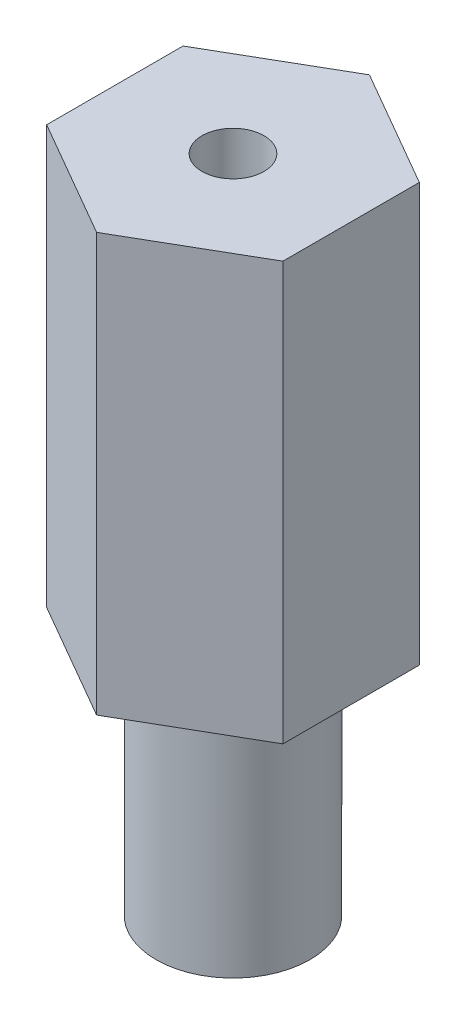
ISO-10303-21;
HEADER;
FILE_DESCRIPTION(('STEP AP214'),'2;1');
FILE_NAME('part.step','',(''),(''),'','','');
FILE_SCHEMA(('AUTOMOTIVE_DESIGN { 1 0 10303 214 1 1 1 1 }'));
ENDSEC;
DATA;
#1=APPLICATION_CONTEXT('core data for automotive mechanical design processes');
#2=APPLICATION_PROTOCOL_DEFINITION('international standard','automotive_design',2000,#1);
#3=PRODUCT_CONTEXT('',#1,'mechanical');
#4=PRODUCT('Part','Part','',(#3));
#5=PRODUCT_RELATED_PRODUCT_CATEGORY('part','',(#4));
#6=PRODUCT_DEFINITION_FORMATION('','',#4);
#7=PRODUCT_DEFINITION_CONTEXT('part definition',#1,'design');
#8=PRODUCT_DEFINITION('design','',#6,#7);
#9=PRODUCT_DEFINITION_SHAPE('','',#8);
#10=(LENGTH_UNIT() NAMED_UNIT(*) SI_UNIT(.MILLI.,.METRE.));
#11=(NAMED_UNIT(*) PLANE_ANGLE_UNIT() SI_UNIT($,.RADIAN.));
#12=(NAMED_UNIT(*) SI_UNIT($,.STERADIAN.) SOLID_ANGLE_UNIT());
#13=UNCERTAINTY_MEASURE_WITH_UNIT(LENGTH_MEASURE(1.E-05),#10,'distance_accuracy_value','');
#14=(GEOMETRIC_REPRESENTATION_CONTEXT(3) GLOBAL_UNCERTAINTY_ASSIGNED_CONTEXT((#13)) GLOBAL_UNIT_ASSIGNED_CONTEXT((#10,
#11,#12)) REPRESENTATION_CONTEXT('',''));
#15=CARTESIAN_POINT('',(0.,0.,0.));
#16=DIRECTION('',(0.,0.,1.));
#17=DIRECTION('',(1.,0.,0.));
#18=AXIS2_PLACEMENT_3D('',#15,#16,#17);
#19=CARTESIAN_POINT('',(2.2606,0.,-1.30515801853007));
#20=DIRECTION('',(0.,1.,0.));
#21=DIRECTION('',(0.,0.,1.));
#22=AXIS2_PLACEMENT_3D('',#19,#20,#21);
#23=PLANE('',#22);
#24=DIRECTION('',(0.,0.,-1.));
#25=VECTOR('',#24,1.);
#26=CARTESIAN_POINT('',(2.2606,0.,1.30515801853007));
#27=LINE('',#26,#25);
#28=CARTESIAN_POINT('',(2.2606,0.,1.30515801853007));
#29=VERTEX_POINT('',#28);
#30=CARTESIAN_POINT('',(2.2606,0.,-1.30515801853007));
#31=VERTEX_POINT('',#30);
#32=EDGE_CURVE('E120',#29,#31,#27,.T.);
#33=ORIENTED_EDGE('',*,*,#32,.F.);
#34=DIRECTION('',(0.866025403784438,0.,-0.5));
#35=VECTOR('',#34,1.);
#36=CARTESIAN_POINT('',(0.,0.,2.61031603706014));
#37=LINE('',#36,#35);
#38=CARTESIAN_POINT('',(0.,0.,2.61031603706014));
#39=VERTEX_POINT('',#38);
#40=EDGE_CURVE('E80',#39,#29,#37,.T.);
#41=ORIENTED_EDGE('',*,*,#40,.F.);
#42=DIRECTION('',(0.866025403784439,0.,0.5));
#43=VECTOR('',#42,1.);
#44=CARTESIAN_POINT('',(-2.2606,0.,1.30515801853007));
#45=LINE('',#44,#43);
#46=CARTESIAN_POINT('',(-2.2606,0.,1.30515801853007));
#47=VERTEX_POINT('',#46);
#48=EDGE_CURVE('E74',#47,#39,#45,.T.);
#49=ORIENTED_EDGE('',*,*,#48,.F.);
#50=DIRECTION('',(0.,0.,1.));
#51=VECTOR('',#50,1.);
#52=CARTESIAN_POINT('',(-2.2606,0.,-1.30515801853007));
#53=LINE('',#52,#51);
#54=CARTESIAN_POINT('',(-2.2606,0.,-1.30515801853007));
#55=VERTEX_POINT('',#54);
#56=EDGE_CURVE('E110',#55,#47,#53,.T.);
#57=ORIENTED_EDGE('',*,*,#56,.F.);
#58=DIRECTION('',(-0.866025403784439,0.,0.5));
#59=VECTOR('',#58,1.);
#60=CARTESIAN_POINT('',(0.,0.,-2.61031603706014));
#61=LINE('',#60,#59);
#62=CARTESIAN_POINT('',(0.,0.,-2.61031603706014));
#63=VERTEX_POINT('',#62);
#64=EDGE_CURVE('E126',#63,#55,#61,.T.);
#65=ORIENTED_EDGE('',*,*,#64,.F.);
#66=DIRECTION('',(-0.866025403784439,0.,-0.5));
#67=VECTOR('',#66,1.);
#68=CARTESIAN_POINT('',(2.2606,0.,-1.30515801853007));
#69=LINE('',#68,#67);
#70=EDGE_CURVE('E123',#31,#63,#69,.T.);
#71=ORIENTED_EDGE('',*,*,#70,.F.);
#72=EDGE_LOOP('',(#33,#41,#49,#57,#65,#71));
#73=FACE_BOUND('',#72,.T.);
#74=CARTESIAN_POINT('',(0.,0.,0.));
#75=DIRECTION('',(0.,1.,0.));
#76=DIRECTION('',(0.,0.,1.));
#77=AXIS2_PLACEMENT_3D('',#74,#75,#76);
#78=CIRCLE('',#77,1.4732);
#79=CARTESIAN_POINT('',(0.,0.,1.4732));
#80=VERTEX_POINT('',#79);
#81=EDGE_CURVE('E11',#80,#80,#78,.F.);
#82=ORIENTED_EDGE('',*,*,#81,.F.);
#83=EDGE_LOOP('',(#82));
#84=FACE_BOUND('',#83,.T.);
#85=ADVANCED_FACE('F34',(#73,#84),#23,.F.);
#86=CARTESIAN_POINT('',(2.2606,8.,1.30515801853007));
#87=DIRECTION('',(-1.,0.,0.));
#88=DIRECTION('',(0.,0.,1.));
#89=AXIS2_PLACEMENT_3D('',#86,#87,#88);
#90=PLANE('',#89);
#91=ORIENTED_EDGE('',*,*,#32,.T.);
#92=DIRECTION('',(0.,-1.,0.));
#93=VECTOR('',#92,1.);
#94=CARTESIAN_POINT('',(2.2606,8.,-1.30515801853007));
#95=LINE('',#94,#93);
#96=CARTESIAN_POINT('',(2.2606,8.,-1.30515801853007));
#97=VERTEX_POINT('',#96);
#98=EDGE_CURVE('E43',#97,#31,#95,.T.);
#99=ORIENTED_EDGE('',*,*,#98,.F.);
#100=DIRECTION('',(0.,0.,-1.));
#101=VECTOR('',#100,1.);
#102=CARTESIAN_POINT('',(2.2606,8.,1.30515801853007));
#103=LINE('',#102,#101);
#104=CARTESIAN_POINT('',(2.2606,8.,1.30515801853007));
#105=VERTEX_POINT('',#104);
#106=EDGE_CURVE('E131',#105,#97,#103,.T.);
#107=ORIENTED_EDGE('',*,*,#106,.F.);
#108=DIRECTION('',(0.,-1.,0.));
#109=VECTOR('',#108,1.);
#110=CARTESIAN_POINT('',(2.2606,8.,1.30515801853007));
#111=LINE('',#110,#109);
#112=EDGE_CURVE('E116',#105,#29,#111,.T.);
#113=ORIENTED_EDGE('',*,*,#112,.T.);
#114=EDGE_LOOP('',(#91,#99,#107,#113));
#115=FACE_BOUND('',#114,.T.);
#116=ADVANCED_FACE('F36',(#115),#90,.F.);
#117=CARTESIAN_POINT('',(2.2606,8.,-1.30515801853007));
#118=DIRECTION('',(-0.5,0.,0.866025403784439));
#119=DIRECTION('',(0.866025403784439,0.,0.5));
#120=AXIS2_PLACEMENT_3D('',#117,#118,#119);
#121=PLANE('',#120);
#122=ORIENTED_EDGE('',*,*,#70,.T.);
#123=DIRECTION('',(0.,-1.,0.));
#124=VECTOR('',#123,1.);
#125=CARTESIAN_POINT('',(0.,8.,-2.61031603706014));
#126=LINE('',#125,#124);
#127=CARTESIAN_POINT('',(0.,8.,-2.61031603706014));
#128=VERTEX_POINT('',#127);
#129=EDGE_CURVE('E135',#128,#63,#126,.T.);
#130=ORIENTED_EDGE('',*,*,#129,.F.);
#131=DIRECTION('',(-0.866025403784439,0.,-0.5));
#132=VECTOR('',#131,1.);
#133=CARTESIAN_POINT('',(2.2606,8.,-1.30515801853007));
#134=LINE('',#133,#132);
#135=EDGE_CURVE('E89',#97,#128,#134,.T.);
#136=ORIENTED_EDGE('',*,*,#135,.F.);
#137=ORIENTED_EDGE('',*,*,#98,.T.);
#138=EDGE_LOOP('',(#122,#130,#136,#137));
#139=FACE_BOUND('',#138,.T.);
#140=ADVANCED_FACE('F138',(#139),#121,.F.);
#141=CARTESIAN_POINT('',(0.,8.,-2.61031603706014));
#142=DIRECTION('',(0.5,0.,0.866025403784439));
#143=DIRECTION('',(0.866025403784439,0.,-0.5));
#144=AXIS2_PLACEMENT_3D('',#141,#142,#143);
#145=PLANE('',#144);
#146=ORIENTED_EDGE('',*,*,#64,.T.);
#147=DIRECTION('',(0.,-1.,0.));
#148=VECTOR('',#147,1.);
#149=CARTESIAN_POINT('',(-2.2606,8.,-1.30515801853007));
#150=LINE('',#149,#148);
#151=CARTESIAN_POINT('',(-2.2606,8.,-1.30515801853007));
#152=VERTEX_POINT('',#151);
#153=EDGE_CURVE('E111',#152,#55,#150,.T.);
#154=ORIENTED_EDGE('',*,*,#153,.F.);
#155=DIRECTION('',(-0.866025403784439,0.,0.5));
#156=VECTOR('',#155,1.);
#157=CARTESIAN_POINT('',(0.,8.,-2.61031603706014));
#158=LINE('',#157,#156);
#159=EDGE_CURVE('E102',#128,#152,#158,.T.);
#160=ORIENTED_EDGE('',*,*,#159,.F.);
#161=ORIENTED_EDGE('',*,*,#129,.T.);
#162=EDGE_LOOP('',(#146,#154,#160,#161));
#163=FACE_BOUND('',#162,.T.);
#164=ADVANCED_FACE('F146',(#163),#145,.F.);
#165=CARTESIAN_POINT('',(-2.2606,8.,-1.30515801853007));
#166=DIRECTION('',(1.,0.,0.));
#167=DIRECTION('',(0.,0.,-1.));
#168=AXIS2_PLACEMENT_3D('',#165,#166,#167);
#169=PLANE('',#168);
#170=ORIENTED_EDGE('',*,*,#56,.T.);
#171=DIRECTION('',(0.,-1.,0.));
#172=VECTOR('',#171,1.);
#173=CARTESIAN_POINT('',(-2.2606,8.,1.30515801853007));
#174=LINE('',#173,#172);
#175=CARTESIAN_POINT('',(-2.2606,8.,1.30515801853007));
#176=VERTEX_POINT('',#175);
#177=EDGE_CURVE('E107',#176,#47,#174,.T.);
#178=ORIENTED_EDGE('',*,*,#177,.F.);
#179=DIRECTION('',(0.,0.,1.));
#180=VECTOR('',#179,1.);
#181=CARTESIAN_POINT('',(-2.2606,8.,-1.30515801853007));
#182=LINE('',#181,#180);
#183=EDGE_CURVE('E96',#152,#176,#182,.T.);
#184=ORIENTED_EDGE('',*,*,#183,.F.);
#185=ORIENTED_EDGE('',*,*,#153,.T.);
#186=EDGE_LOOP('',(#170,#178,#184,#185));
#187=FACE_BOUND('',#186,.T.);
#188=ADVANCED_FACE('F108',(#187),#169,.F.);
#189=CARTESIAN_POINT('',(-2.2606,8.,1.30515801853007));
#190=DIRECTION('',(0.5,0.,-0.866025403784439));
#191=DIRECTION('',(-0.866025403784439,0.,-0.5));
#192=AXIS2_PLACEMENT_3D('',#189,#190,#191);
#193=PLANE('',#192);
#194=ORIENTED_EDGE('',*,*,#48,.T.);
#195=DIRECTION('',(0.,-1.,0.));
#196=VECTOR('',#195,1.);
#197=CARTESIAN_POINT('',(0.,8.,2.61031603706014));
#198=LINE('',#197,#196);
#199=CARTESIAN_POINT('',(0.,8.,2.61031603706014));
#200=VERTEX_POINT('',#199);
#201=EDGE_CURVE('E112',#200,#39,#198,.T.);
#202=ORIENTED_EDGE('',*,*,#201,.F.);
#203=DIRECTION('',(0.866025403784439,0.,0.5));
#204=VECTOR('',#203,1.);
#205=CARTESIAN_POINT('',(-2.2606,8.,1.30515801853007));
#206=LINE('',#205,#204);
#207=EDGE_CURVE('E100',#176,#200,#206,.T.);
#208=ORIENTED_EDGE('',*,*,#207,.F.);
#209=ORIENTED_EDGE('',*,*,#177,.T.);
#210=EDGE_LOOP('',(#194,#202,#208,#209));
#211=FACE_BOUND('',#210,.T.);
#212=ADVANCED_FACE('F114',(#211),#193,.F.);
#213=CARTESIAN_POINT('',(0.,8.,2.61031603706014));
#214=DIRECTION('',(-0.5,0.,-0.866025403784439));
#215=DIRECTION('',(-0.866025403784439,0.,0.5));
#216=AXIS2_PLACEMENT_3D('',#213,#214,#215);
#217=PLANE('',#216);
#218=ORIENTED_EDGE('',*,*,#40,.T.);
#219=ORIENTED_EDGE('',*,*,#112,.F.);
#220=DIRECTION('',(0.866025403784438,0.,-0.5));
#221=VECTOR('',#220,1.);
#222=CARTESIAN_POINT('',(0.,8.,2.61031603706014));
#223=LINE('',#222,#221);
#224=EDGE_CURVE('E51',#200,#105,#223,.T.);
#225=ORIENTED_EDGE('',*,*,#224,.F.);
#226=ORIENTED_EDGE('',*,*,#201,.T.);
#227=EDGE_LOOP('',(#218,#219,#225,#226));
#228=FACE_BOUND('',#227,.T.);
#229=ADVANCED_FACE('F170',(#228),#217,.F.);
#230=CARTESIAN_POINT('',(2.2606,8.,-1.30515801853007));
#231=DIRECTION('',(0.,1.,0.));
#232=DIRECTION('',(0.,0.,1.));
#233=AXIS2_PLACEMENT_3D('',#230,#231,#232);
#234=PLANE('',#233);
#235=CARTESIAN_POINT('',(0.,8.,0.));
#236=DIRECTION('',(0.,1.,0.));
#237=DIRECTION('',(0.,0.,1.));
#238=AXIS2_PLACEMENT_3D('',#235,#236,#237);
#239=CIRCLE('',#238,0.593671867306966);
#240=CARTESIAN_POINT('',(0.,8.,0.593671867306966));
#241=VERTEX_POINT('',#240);
#242=EDGE_CURVE('E153',#241,#241,#239,.T.);
#243=ORIENTED_EDGE('',*,*,#242,.F.);
#244=EDGE_LOOP('',(#243));
#245=FACE_BOUND('',#244,.T.);
#246=ORIENTED_EDGE('',*,*,#106,.T.);
#247=ORIENTED_EDGE('',*,*,#135,.T.);
#248=ORIENTED_EDGE('',*,*,#159,.T.);
#249=ORIENTED_EDGE('',*,*,#183,.T.);
#250=ORIENTED_EDGE('',*,*,#207,.T.);
#251=ORIENTED_EDGE('',*,*,#224,.T.);
#252=EDGE_LOOP('',(#246,#247,#248,#249,#250,#251));
#253=FACE_BOUND('',#252,.T.);
#254=ADVANCED_FACE('F98',(#245,#253),#234,.T.);
#255=CARTESIAN_POINT('',(0.,-4.6228,0.));
#256=DIRECTION('',(0.,1.,0.));
#257=DIRECTION('',(0.,0.,1.));
#258=AXIS2_PLACEMENT_3D('',#255,#256,#257);
#259=CYLINDRICAL_SURFACE('',#258,1.4732);
#260=CARTESIAN_POINT('',(0.,-4.6228,0.));
#261=DIRECTION('',(0.,-1.,0.));
#262=DIRECTION('',(0.,0.,-1.));
#263=AXIS2_PLACEMENT_3D('',#260,#261,#262);
#264=CIRCLE('',#263,1.4732);
#265=CARTESIAN_POINT('',(0.,-4.6228,-1.4732));
#266=VERTEX_POINT('',#265);
#267=EDGE_CURVE('E124',#266,#266,#264,.T.);
#268=ORIENTED_EDGE('',*,*,#267,.F.);
#269=EDGE_LOOP('',(#268));
#270=FACE_BOUND('',#269,.T.);
#271=ORIENTED_EDGE('',*,*,#81,.T.);
#272=EDGE_LOOP('',(#271));
#273=FACE_BOUND('',#272,.T.);
#274=ADVANCED_FACE('F169',(#270,#273),#259,.T.);
#275=CARTESIAN_POINT('',(0.,-4.6228,0.));
#276=DIRECTION('',(0.,-1.,0.));
#277=DIRECTION('',(0.,0.,-1.));
#278=AXIS2_PLACEMENT_3D('',#275,#276,#277);
#279=PLANE('',#278);
#280=ORIENTED_EDGE('',*,*,#267,.T.);
#281=EDGE_LOOP('',(#280));
#282=FACE_BOUND('',#281,.T.);
#283=ADVANCED_FACE('F164',(#282),#279,.T.);
#284=CARTESIAN_POINT('',(0.,5.46,0.));
#285=DIRECTION('',(0.,1.,0.));
#286=DIRECTION('',(0.,0.,1.));
#287=AXIS2_PLACEMENT_3D('',#284,#285,#286);
#288=CYLINDRICAL_SURFACE('',#287,0.593671867306966);
#289=CARTESIAN_POINT('',(0.,5.46,0.));
#290=DIRECTION('',(0.,1.,0.));
#291=DIRECTION('',(0.,0.,1.));
#292=AXIS2_PLACEMENT_3D('',#289,#290,#291);
#293=CIRCLE('',#292,0.593671867306966);
#294=CARTESIAN_POINT('',(0.,5.46,0.593671867306966));
#295=VERTEX_POINT('',#294);
#296=EDGE_CURVE('E152',#295,#295,#293,.T.);
#297=ORIENTED_EDGE('',*,*,#296,.F.);
#298=EDGE_LOOP('',(#297));
#299=FACE_BOUND('',#298,.T.);
#300=ORIENTED_EDGE('',*,*,#242,.T.);
#301=EDGE_LOOP('',(#300));
#302=FACE_BOUND('',#301,.T.);
#303=ADVANCED_FACE('F161',(#299,#302),#288,.F.);
#304=CARTESIAN_POINT('',(0.,5.46,0.));
#305=DIRECTION('',(0.,1.,0.));
#306=DIRECTION('',(0.,0.,1.));
#307=AXIS2_PLACEMENT_3D('',#304,#305,#306);
#308=PLANE('',#307);
#309=ORIENTED_EDGE('',*,*,#296,.T.);
#310=EDGE_LOOP('',(#309));
#311=FACE_BOUND('',#310,.T.);
#312=ADVANCED_FACE('F159',(#311),#308,.T.);
#313=CLOSED_SHELL('',(#85,#116,#140,#164,#188,#212,#229,#254,#274,#283,#303,#312));
#314=MANIFOLD_SOLID_BREP('B2',#313);
#315=ADVANCED_BREP_SHAPE_REPRESENTATION('',(#18,#314),#14);
#316=SHAPE_DEFINITION_REPRESENTATION(#9,#315);
ENDSEC;
END-ISO-10303-21;
